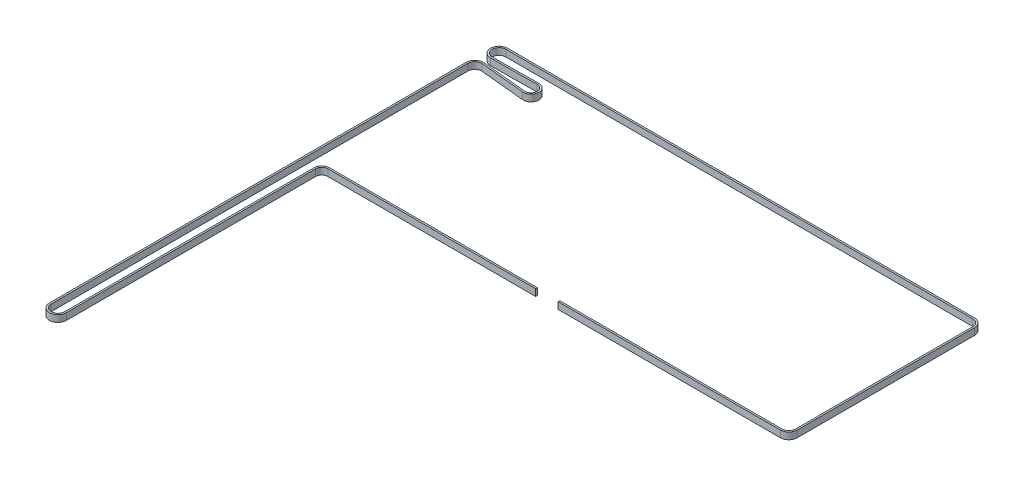
ISO-10303-21;
HEADER;
FILE_DESCRIPTION(('STEP AP214'),'2;1');
FILE_NAME('part.step','',(''),(''),'','','');
FILE_SCHEMA(('AUTOMOTIVE_DESIGN { 1 0 10303 214 1 1 1 1 }'));
ENDSEC;
DATA;
#1=APPLICATION_CONTEXT('core data for automotive mechanical design processes');
#2=APPLICATION_PROTOCOL_DEFINITION('international standard','automotive_design',2000,#1);
#3=PRODUCT_CONTEXT('',#1,'mechanical');
#4=PRODUCT('Part','Part','',(#3));
#5=PRODUCT_RELATED_PRODUCT_CATEGORY('part','',(#4));
#6=PRODUCT_DEFINITION_FORMATION('','',#4);
#7=PRODUCT_DEFINITION_CONTEXT('part definition',#1,'design');
#8=PRODUCT_DEFINITION('design','',#6,#7);
#9=PRODUCT_DEFINITION_SHAPE('','',#8);
#10=(LENGTH_UNIT() NAMED_UNIT(*) SI_UNIT(.MILLI.,.METRE.));
#11=(NAMED_UNIT(*) PLANE_ANGLE_UNIT() SI_UNIT($,.RADIAN.));
#12=(NAMED_UNIT(*) SI_UNIT($,.STERADIAN.) SOLID_ANGLE_UNIT());
#13=UNCERTAINTY_MEASURE_WITH_UNIT(LENGTH_MEASURE(1.E-05),#10,'distance_accuracy_value','');
#14=(GEOMETRIC_REPRESENTATION_CONTEXT(3) GLOBAL_UNCERTAINTY_ASSIGNED_CONTEXT((#13)) GLOBAL_UNIT_ASSIGNED_CONTEXT((#10,
#11,#12)) REPRESENTATION_CONTEXT('',''));
#15=CARTESIAN_POINT('',(0.,0.,0.));
#16=DIRECTION('',(0.,0.,1.));
#17=DIRECTION('',(1.,0.,0.));
#18=AXIS2_PLACEMENT_3D('',#15,#16,#17);
#19=CARTESIAN_POINT('',(207.5,190.5,-34.95));
#20=DIRECTION('',(0.,0.,1.));
#21=DIRECTION('',(1.,0.,0.));
#22=AXIS2_PLACEMENT_3D('',#19,#20,#21);
#23=PLANE('',#22);
#24=DIRECTION('',(-1.,0.,0.));
#25=VECTOR('',#24,1.);
#26=CARTESIAN_POINT('',(207.5,184.5,-34.95));
#27=LINE('',#26,#25);
#28=CARTESIAN_POINT('',(207.5,184.5,-34.95));
#29=VERTEX_POINT('',#28);
#30=CARTESIAN_POINT('',(10.,184.5,-34.95));
#31=VERTEX_POINT('',#30);
#32=EDGE_CURVE('E256',#29,#31,#27,.T.);
#33=ORIENTED_EDGE('',*,*,#32,.T.);
#34=DIRECTION('',(0.,-1.,0.));
#35=VECTOR('',#34,1.);
#36=CARTESIAN_POINT('',(10.,190.5,-34.95));
#37=LINE('',#36,#35);
#38=CARTESIAN_POINT('',(10.,190.5,-34.95));
#39=VERTEX_POINT('',#38);
#40=EDGE_CURVE('E11',#39,#31,#37,.T.);
#41=ORIENTED_EDGE('',*,*,#40,.F.);
#42=DIRECTION('',(-1.,0.,0.));
#43=VECTOR('',#42,1.);
#44=CARTESIAN_POINT('',(207.5,190.5,-34.95));
#45=LINE('',#44,#43);
#46=CARTESIAN_POINT('',(207.5,190.5,-34.95));
#47=VERTEX_POINT('',#46);
#48=EDGE_CURVE('E145',#47,#39,#45,.T.);
#49=ORIENTED_EDGE('',*,*,#48,.F.);
#50=DIRECTION('',(0.,-1.,0.));
#51=VECTOR('',#50,1.);
#52=CARTESIAN_POINT('',(207.5,190.5,-34.95));
#53=LINE('',#52,#51);
#54=EDGE_CURVE('E252',#47,#29,#53,.T.);
#55=ORIENTED_EDGE('',*,*,#54,.T.);
#56=EDGE_LOOP('',(#33,#41,#49,#55));
#57=FACE_BOUND('',#56,.T.);
#58=ADVANCED_FACE('F17',(#57),#23,.F.);
#59=CARTESIAN_POINT('',(10.,190.5,-33.45));
#60=DIRECTION('',(-1.,0.,0.));
#61=DIRECTION('',(0.,0.,1.));
#62=AXIS2_PLACEMENT_3D('',#59,#60,#61);
#63=PLANE('',#62);
#64=DIRECTION('',(0.,0.,-1.));
#65=VECTOR('',#64,1.);
#66=CARTESIAN_POINT('',(10.,184.5,-33.45));
#67=LINE('',#66,#65);
#68=CARTESIAN_POINT('',(10.,184.5,-33.45));
#69=VERTEX_POINT('',#68);
#70=EDGE_CURVE('E259',#69,#31,#67,.T.);
#71=ORIENTED_EDGE('',*,*,#70,.F.);
#72=DIRECTION('',(0.,-1.,0.));
#73=VECTOR('',#72,1.);
#74=CARTESIAN_POINT('',(10.,190.5,-33.45));
#75=LINE('',#74,#73);
#76=CARTESIAN_POINT('',(10.,190.5,-33.45));
#77=VERTEX_POINT('',#76);
#78=EDGE_CURVE('E25',#77,#69,#75,.T.);
#79=ORIENTED_EDGE('',*,*,#78,.F.);
#80=DIRECTION('',(0.,0.,-1.));
#81=VECTOR('',#80,1.);
#82=CARTESIAN_POINT('',(10.,190.5,-33.45));
#83=LINE('',#82,#81);
#84=EDGE_CURVE('E421',#77,#39,#83,.T.);
#85=ORIENTED_EDGE('',*,*,#84,.T.);
#86=ORIENTED_EDGE('',*,*,#40,.T.);
#87=EDGE_LOOP('',(#71,#79,#85,#86));
#88=FACE_BOUND('',#87,.T.);
#89=ADVANCED_FACE('F408',(#88),#63,.T.);
#90=CARTESIAN_POINT('',(207.5,190.5,-33.45));
#91=DIRECTION('',(0.,0.,1.));
#92=DIRECTION('',(1.,0.,0.));
#93=AXIS2_PLACEMENT_3D('',#90,#91,#92);
#94=PLANE('',#93);
#95=DIRECTION('',(-1.,0.,0.));
#96=VECTOR('',#95,1.);
#97=CARTESIAN_POINT('',(207.5,184.5,-33.45));
#98=LINE('',#97,#96);
#99=CARTESIAN_POINT('',(207.5,184.5,-33.45));
#100=VERTEX_POINT('',#99);
#101=EDGE_CURVE('E262',#100,#69,#98,.T.);
#102=ORIENTED_EDGE('',*,*,#101,.F.);
#103=DIRECTION('',(0.,-1.,0.));
#104=VECTOR('',#103,1.);
#105=CARTESIAN_POINT('',(207.5,190.5,-33.45));
#106=LINE('',#105,#104);
#107=CARTESIAN_POINT('',(207.5,190.5,-33.45));
#108=VERTEX_POINT('',#107);
#109=EDGE_CURVE('E398',#108,#100,#106,.T.);
#110=ORIENTED_EDGE('',*,*,#109,.F.);
#111=DIRECTION('',(-1.,0.,0.));
#112=VECTOR('',#111,1.);
#113=CARTESIAN_POINT('',(207.5,190.5,-33.45));
#114=LINE('',#113,#112);
#115=EDGE_CURVE('E405',#108,#77,#114,.T.);
#116=ORIENTED_EDGE('',*,*,#115,.T.);
#117=ORIENTED_EDGE('',*,*,#78,.T.);
#118=EDGE_LOOP('',(#102,#110,#116,#117));
#119=FACE_BOUND('',#118,.T.);
#120=ADVANCED_FACE('F403',(#119),#94,.T.);
#121=CARTESIAN_POINT('',(207.5,190.5,-40.95));
#122=DIRECTION('',(0.,-1.,0.));
#123=DIRECTION('',(0.,0.,-1.));
#124=AXIS2_PLACEMENT_3D('',#121,#122,#123);
#125=CYLINDRICAL_SURFACE('',#124,7.5);
#126=CARTESIAN_POINT('',(207.5,184.5,-40.95));
#127=DIRECTION('',(0.,1.,0.));
#128=DIRECTION('',(1.,0.,0.));
#129=AXIS2_PLACEMENT_3D('',#126,#127,#128);
#130=CIRCLE('',#129,7.5);
#131=CARTESIAN_POINT('',(215.,184.5,-40.95));
#132=VERTEX_POINT('',#131);
#133=EDGE_CURVE('E265',#132,#100,#130,.F.);
#134=ORIENTED_EDGE('',*,*,#133,.F.);
#135=DIRECTION('',(0.,-1.,0.));
#136=VECTOR('',#135,1.);
#137=CARTESIAN_POINT('',(215.,190.5,-40.95));
#138=LINE('',#137,#136);
#139=CARTESIAN_POINT('',(215.,190.5,-40.95));
#140=VERTEX_POINT('',#139);
#141=EDGE_CURVE('E396',#140,#132,#138,.T.);
#142=ORIENTED_EDGE('',*,*,#141,.F.);
#143=CARTESIAN_POINT('',(207.5,190.5,-40.95));
#144=DIRECTION('',(0.,1.,0.));
#145=DIRECTION('',(1.,0.,0.));
#146=AXIS2_PLACEMENT_3D('',#143,#144,#145);
#147=CIRCLE('',#146,7.5);
#148=EDGE_CURVE('E418',#140,#108,#147,.F.);
#149=ORIENTED_EDGE('',*,*,#148,.T.);
#150=ORIENTED_EDGE('',*,*,#109,.T.);
#151=EDGE_LOOP('',(#134,#142,#149,#150));
#152=FACE_BOUND('',#151,.T.);
#153=ADVANCED_FACE('F415',(#152),#125,.T.);
#154=CARTESIAN_POINT('',(215.,190.5,-198.5));
#155=DIRECTION('',(1.,0.,0.));
#156=DIRECTION('',(0.,0.,-1.));
#157=AXIS2_PLACEMENT_3D('',#154,#155,#156);
#158=PLANE('',#157);
#159=DIRECTION('',(0.,0.,-1.));
#160=VECTOR('',#159,1.);
#161=CARTESIAN_POINT('',(215.,184.5,-198.5));
#162=LINE('',#161,#160);
#163=CARTESIAN_POINT('',(215.,184.5,-198.5));
#164=VERTEX_POINT('',#163);
#165=EDGE_CURVE('E268',#164,#132,#162,.F.);
#166=ORIENTED_EDGE('',*,*,#165,.F.);
#167=DIRECTION('',(0.,-1.,0.));
#168=VECTOR('',#167,1.);
#169=CARTESIAN_POINT('',(215.,190.5,-198.5));
#170=LINE('',#169,#168);
#171=CARTESIAN_POINT('',(215.,190.5,-198.5));
#172=VERTEX_POINT('',#171);
#173=EDGE_CURVE('E394',#172,#164,#170,.T.);
#174=ORIENTED_EDGE('',*,*,#173,.F.);
#175=DIRECTION('',(0.,0.,-1.));
#176=VECTOR('',#175,1.);
#177=CARTESIAN_POINT('',(215.,190.5,-198.5));
#178=LINE('',#177,#176);
#179=EDGE_CURVE('E423',#172,#140,#178,.F.);
#180=ORIENTED_EDGE('',*,*,#179,.T.);
#181=ORIENTED_EDGE('',*,*,#141,.T.);
#182=EDGE_LOOP('',(#166,#174,#180,#181));
#183=FACE_BOUND('',#182,.T.);
#184=ADVANCED_FACE('F523',(#183),#158,.T.);
#185=CARTESIAN_POINT('',(207.5,190.5,-198.5));
#186=DIRECTION('',(0.,-1.,0.));
#187=DIRECTION('',(0.,0.,-1.));
#188=AXIS2_PLACEMENT_3D('',#185,#186,#187);
#189=CYLINDRICAL_SURFACE('',#188,7.5);
#190=CARTESIAN_POINT('',(207.5,184.5,-198.5));
#191=DIRECTION('',(0.,1.,0.));
#192=DIRECTION('',(1.,0.,0.));
#193=AXIS2_PLACEMENT_3D('',#190,#191,#192);
#194=CIRCLE('',#193,7.5);
#195=CARTESIAN_POINT('',(207.5,184.5,-206.));
#196=VERTEX_POINT('',#195);
#197=EDGE_CURVE('E271',#196,#164,#194,.F.);
#198=ORIENTED_EDGE('',*,*,#197,.F.);
#199=DIRECTION('',(0.,-1.,0.));
#200=VECTOR('',#199,1.);
#201=CARTESIAN_POINT('',(207.5,190.5,-206.));
#202=LINE('',#201,#200);
#203=CARTESIAN_POINT('',(207.5,190.5,-206.));
#204=VERTEX_POINT('',#203);
#205=EDGE_CURVE('E392',#204,#196,#202,.T.);
#206=ORIENTED_EDGE('',*,*,#205,.F.);
#207=CARTESIAN_POINT('',(207.5,190.5,-198.5));
#208=DIRECTION('',(0.,1.,0.));
#209=DIRECTION('',(1.,0.,0.));
#210=AXIS2_PLACEMENT_3D('',#207,#208,#209);
#211=CIRCLE('',#210,7.5);
#212=EDGE_CURVE('E429',#204,#172,#211,.F.);
#213=ORIENTED_EDGE('',*,*,#212,.T.);
#214=ORIENTED_EDGE('',*,*,#173,.T.);
#215=EDGE_LOOP('',(#198,#206,#213,#214));
#216=FACE_BOUND('',#215,.T.);
#217=ADVANCED_FACE('F526',(#216),#189,.T.);
#218=CARTESIAN_POINT('',(-207.5,190.5,-206.));
#219=DIRECTION('',(0.,0.,-1.));
#220=DIRECTION('',(-1.,0.,0.));
#221=AXIS2_PLACEMENT_3D('',#218,#219,#220);
#222=PLANE('',#221);
#223=DIRECTION('',(1.,0.,0.));
#224=VECTOR('',#223,1.);
#225=CARTESIAN_POINT('',(-207.5,184.5,-206.));
#226=LINE('',#225,#224);
#227=CARTESIAN_POINT('',(-207.5,184.5,-206.));
#228=VERTEX_POINT('',#227);
#229=EDGE_CURVE('E274',#228,#196,#226,.T.);
#230=ORIENTED_EDGE('',*,*,#229,.F.);
#231=DIRECTION('',(0.,-1.,0.));
#232=VECTOR('',#231,1.);
#233=CARTESIAN_POINT('',(-207.5,190.5,-206.));
#234=LINE('',#233,#232);
#235=CARTESIAN_POINT('',(-207.5,190.5,-206.));
#236=VERTEX_POINT('',#235);
#237=EDGE_CURVE('E390',#236,#228,#234,.T.);
#238=ORIENTED_EDGE('',*,*,#237,.F.);
#239=DIRECTION('',(1.,0.,0.));
#240=VECTOR('',#239,1.);
#241=CARTESIAN_POINT('',(-207.5,190.5,-206.));
#242=LINE('',#241,#240);
#243=EDGE_CURVE('E432',#236,#204,#242,.T.);
#244=ORIENTED_EDGE('',*,*,#243,.T.);
#245=ORIENTED_EDGE('',*,*,#205,.T.);
#246=EDGE_LOOP('',(#230,#238,#244,#245));
#247=FACE_BOUND('',#246,.T.);
#248=ADVANCED_FACE('F530',(#247),#222,.T.);
#249=CARTESIAN_POINT('',(-207.5,190.5,-198.5));
#250=DIRECTION('',(0.,-1.,0.));
#251=DIRECTION('',(0.,0.,-1.));
#252=AXIS2_PLACEMENT_3D('',#249,#250,#251);
#253=CYLINDRICAL_SURFACE('',#252,7.5);
#254=CARTESIAN_POINT('',(-207.5,184.5,-198.5));
#255=DIRECTION('',(0.,1.,0.));
#256=DIRECTION('',(1.,0.,0.));
#257=AXIS2_PLACEMENT_3D('',#254,#255,#256);
#258=CIRCLE('',#257,7.5);
#259=CARTESIAN_POINT('',(-207.426720120552,184.5,-191.000358004593));
#260=VERTEX_POINT('',#259);
#261=EDGE_CURVE('E277',#260,#228,#258,.F.);
#262=ORIENTED_EDGE('',*,*,#261,.F.);
#263=DIRECTION('',(0.,-1.,0.));
#264=VECTOR('',#263,1.);
#265=CARTESIAN_POINT('',(-207.426720120552,190.5,-191.000358004593));
#266=LINE('',#265,#264);
#267=CARTESIAN_POINT('',(-207.426720120552,190.5,-191.000358004593));
#268=VERTEX_POINT('',#267);
#269=EDGE_CURVE('E388',#268,#260,#266,.T.);
#270=ORIENTED_EDGE('',*,*,#269,.F.);
#271=CARTESIAN_POINT('',(-207.5,190.5,-198.5));
#272=DIRECTION('',(0.,1.,0.));
#273=DIRECTION('',(1.,0.,0.));
#274=AXIS2_PLACEMENT_3D('',#271,#272,#273);
#275=CIRCLE('',#274,7.5);
#276=EDGE_CURVE('E435',#268,#236,#275,.F.);
#277=ORIENTED_EDGE('',*,*,#276,.T.);
#278=ORIENTED_EDGE('',*,*,#237,.T.);
#279=EDGE_LOOP('',(#262,#270,#277,#278));
#280=FACE_BOUND('',#279,.T.);
#281=ADVANCED_FACE('F534',(#280),#253,.T.);
#282=CARTESIAN_POINT('',(-166.552761513203,190.5,-191.399742236688));
#283=DIRECTION('',(0.0097706505931108,0.,0.999952266054229));
#284=DIRECTION('',(0.999952266054229,0.,-0.0097706505931108));
#285=AXIS2_PLACEMENT_3D('',#282,#283,#284);
#286=PLANE('',#285);
#287=DIRECTION('',(-0.999952266054229,0.,0.0097706505931108));
#288=VECTOR('',#287,1.);
#289=CARTESIAN_POINT('',(-166.552761513203,184.5,-191.399742236688));
#290=LINE('',#289,#288);
#291=CARTESIAN_POINT('',(-166.552761513203,184.5,-191.399742236688));
#292=VERTEX_POINT('',#291);
#293=EDGE_CURVE('E280',#292,#260,#290,.T.);
#294=ORIENTED_EDGE('',*,*,#293,.F.);
#295=DIRECTION('',(0.,-1.,0.));
#296=VECTOR('',#295,1.);
#297=CARTESIAN_POINT('',(-166.552761513203,190.5,-191.399742236688));
#298=LINE('',#297,#296);
#299=CARTESIAN_POINT('',(-166.552761513203,190.5,-191.399742236688));
#300=VERTEX_POINT('',#299);
#301=EDGE_CURVE('E386',#300,#292,#298,.T.);
#302=ORIENTED_EDGE('',*,*,#301,.F.);
#303=DIRECTION('',(-0.999952266054229,0.,0.0097706505931108));
#304=VECTOR('',#303,1.);
#305=CARTESIAN_POINT('',(-166.552761513203,190.5,-191.399742236688));
#306=LINE('',#305,#304);
#307=EDGE_CURVE('E438',#300,#268,#306,.T.);
#308=ORIENTED_EDGE('',*,*,#307,.T.);
#309=ORIENTED_EDGE('',*,*,#269,.T.);
#310=EDGE_LOOP('',(#294,#302,#308,#309));
#311=FACE_BOUND('',#310,.T.);
#312=ADVANCED_FACE('F538',(#311),#286,.T.);
#313=CARTESIAN_POINT('',(-166.5,190.5,-185.999999999996));
#314=DIRECTION('',(0.,-1.,0.));
#315=DIRECTION('',(0.,0.,-1.));
#316=AXIS2_PLACEMENT_3D('',#313,#314,#315);
#317=CYLINDRICAL_SURFACE('',#316,5.4);
#318=CARTESIAN_POINT('',(-166.5,184.5,-185.999999999996));
#319=DIRECTION('',(0.,1.,0.));
#320=DIRECTION('',(1.,0.,0.));
#321=AXIS2_PLACEMENT_3D('',#318,#319,#320);
#322=CIRCLE('',#321,5.4);
#323=CARTESIAN_POINT('',(-167.005756118477,184.5,-180.623736357965));
#324=VERTEX_POINT('',#323);
#325=EDGE_CURVE('E283',#324,#292,#322,.T.);
#326=ORIENTED_EDGE('',*,*,#325,.F.);
#327=DIRECTION('',(0.,-1.,0.));
#328=VECTOR('',#327,1.);
#329=CARTESIAN_POINT('',(-167.005756118477,190.5,-180.623736357965));
#330=LINE('',#329,#328);
#331=CARTESIAN_POINT('',(-167.005756118477,190.5,-180.623736357965));
#332=VERTEX_POINT('',#331);
#333=EDGE_CURVE('E384',#332,#324,#330,.T.);
#334=ORIENTED_EDGE('',*,*,#333,.F.);
#335=CARTESIAN_POINT('',(-166.5,190.5,-185.999999999996));
#336=DIRECTION('',(0.,1.,0.));
#337=DIRECTION('',(1.,0.,0.));
#338=AXIS2_PLACEMENT_3D('',#335,#336,#337);
#339=CIRCLE('',#338,5.4);
#340=EDGE_CURVE('E441',#332,#300,#339,.T.);
#341=ORIENTED_EDGE('',*,*,#340,.T.);
#342=ORIENTED_EDGE('',*,*,#301,.T.);
#343=EDGE_LOOP('',(#326,#334,#341,#342));
#344=FACE_BOUND('',#343,.T.);
#345=ADVANCED_FACE('F542',(#344),#317,.F.);
#346=CARTESIAN_POINT('',(-206.797560946561,190.5,-184.367032836154));
#347=DIRECTION('',(0.0936585404586421,0.,-0.995604378153871));
#348=DIRECTION('',(-0.995604378153871,0.,-0.0936585404586421));
#349=AXIS2_PLACEMENT_3D('',#346,#347,#348);
#350=PLANE('',#349);
#351=DIRECTION('',(0.995604378153871,0.,0.0936585404586421));
#352=VECTOR('',#351,1.);
#353=CARTESIAN_POINT('',(-206.797560946561,184.5,-184.367032836154));
#354=LINE('',#353,#352);
#355=CARTESIAN_POINT('',(-206.797560946561,184.5,-184.367032836154));
#356=VERTEX_POINT('',#355);
#357=EDGE_CURVE('E286',#356,#324,#354,.T.);
#358=ORIENTED_EDGE('',*,*,#357,.F.);
#359=DIRECTION('',(0.,-1.,0.));
#360=VECTOR('',#359,1.);
#361=CARTESIAN_POINT('',(-206.797560946561,190.5,-184.367032836154));
#362=LINE('',#361,#360);
#363=CARTESIAN_POINT('',(-206.797560946561,190.5,-184.367032836154));
#364=VERTEX_POINT('',#363);
#365=EDGE_CURVE('E382',#364,#356,#362,.T.);
#366=ORIENTED_EDGE('',*,*,#365,.F.);
#367=DIRECTION('',(0.995604378153871,0.,0.0936585404586421));
#368=VECTOR('',#367,1.);
#369=CARTESIAN_POINT('',(-206.797560946561,190.5,-184.367032836154));
#370=LINE('',#369,#368);
#371=EDGE_CURVE('E444',#364,#332,#370,.T.);
#372=ORIENTED_EDGE('',*,*,#371,.T.);
#373=ORIENTED_EDGE('',*,*,#333,.T.);
#374=EDGE_LOOP('',(#358,#366,#372,#373));
#375=FACE_BOUND('',#374,.T.);
#376=ADVANCED_FACE('F546',(#375),#350,.T.);
#377=CARTESIAN_POINT('',(-207.5,190.5,-176.9));
#378=DIRECTION('',(0.,-1.,0.));
#379=DIRECTION('',(0.,0.,-1.));
#380=AXIS2_PLACEMENT_3D('',#377,#378,#379);
#381=CYLINDRICAL_SURFACE('',#380,7.5);
#382=CARTESIAN_POINT('',(-207.5,184.5,-176.9));
#383=DIRECTION('',(0.,1.,0.));
#384=DIRECTION('',(1.,0.,0.));
#385=AXIS2_PLACEMENT_3D('',#382,#383,#384);
#386=CIRCLE('',#385,7.5);
#387=CARTESIAN_POINT('',(-215.,184.5,-176.9));
#388=VERTEX_POINT('',#387);
#389=EDGE_CURVE('E289',#388,#356,#386,.F.);
#390=ORIENTED_EDGE('',*,*,#389,.F.);
#391=DIRECTION('',(0.,-1.,0.));
#392=VECTOR('',#391,1.);
#393=CARTESIAN_POINT('',(-215.,190.5,-176.9));
#394=LINE('',#393,#392);
#395=CARTESIAN_POINT('',(-215.,190.5,-176.9));
#396=VERTEX_POINT('',#395);
#397=EDGE_CURVE('E380',#396,#388,#394,.T.);
#398=ORIENTED_EDGE('',*,*,#397,.F.);
#399=CARTESIAN_POINT('',(-207.5,190.5,-176.9));
#400=DIRECTION('',(0.,1.,0.));
#401=DIRECTION('',(1.,0.,0.));
#402=AXIS2_PLACEMENT_3D('',#399,#400,#401);
#403=CIRCLE('',#402,7.5);
#404=EDGE_CURVE('E447',#396,#364,#403,.F.);
#405=ORIENTED_EDGE('',*,*,#404,.T.);
#406=ORIENTED_EDGE('',*,*,#365,.T.);
#407=EDGE_LOOP('',(#390,#398,#405,#406));
#408=FACE_BOUND('',#407,.T.);
#409=ADVANCED_FACE('F550',(#408),#381,.T.);
#410=CARTESIAN_POINT('',(-215.,190.5,-176.9));
#411=DIRECTION('',(-1.,0.,0.));
#412=DIRECTION('',(0.,0.,1.));
#413=AXIS2_PLACEMENT_3D('',#410,#411,#412);
#414=PLANE('',#413);
#415=DIRECTION('',(0.,0.,-1.));
#416=VECTOR('',#415,1.);
#417=CARTESIAN_POINT('',(-215.,184.5,-176.9));
#418=LINE('',#417,#416);
#419=CARTESIAN_POINT('',(-215.,184.5,193.5));
#420=VERTEX_POINT('',#419);
#421=EDGE_CURVE('E292',#420,#388,#418,.T.);
#422=ORIENTED_EDGE('',*,*,#421,.F.);
#423=DIRECTION('',(0.,-1.,0.));
#424=VECTOR('',#423,1.);
#425=CARTESIAN_POINT('',(-215.,190.5,193.5));
#426=LINE('',#425,#424);
#427=CARTESIAN_POINT('',(-215.,190.5,193.5));
#428=VERTEX_POINT('',#427);
#429=EDGE_CURVE('E378',#428,#420,#426,.T.);
#430=ORIENTED_EDGE('',*,*,#429,.F.);
#431=DIRECTION('',(0.,0.,-1.));
#432=VECTOR('',#431,1.);
#433=CARTESIAN_POINT('',(-215.,190.5,-176.9));
#434=LINE('',#433,#432);
#435=EDGE_CURVE('E450',#428,#396,#434,.T.);
#436=ORIENTED_EDGE('',*,*,#435,.T.);
#437=ORIENTED_EDGE('',*,*,#397,.T.);
#438=EDGE_LOOP('',(#422,#430,#436,#437));
#439=FACE_BOUND('',#438,.T.);
#440=ADVANCED_FACE('F554',(#439),#414,.T.);
#441=CARTESIAN_POINT('',(-207.5,190.5,193.5));
#442=DIRECTION('',(0.,-1.,0.));
#443=DIRECTION('',(0.,0.,-1.));
#444=AXIS2_PLACEMENT_3D('',#441,#442,#443);
#445=CYLINDRICAL_SURFACE('',#444,7.5);
#446=CARTESIAN_POINT('',(-207.5,184.5,193.5));
#447=DIRECTION('',(0.,1.,0.));
#448=DIRECTION('',(1.,0.,0.));
#449=AXIS2_PLACEMENT_3D('',#446,#447,#448);
#450=CIRCLE('',#449,7.5);
#451=CARTESIAN_POINT('',(-200.,184.5,193.5));
#452=VERTEX_POINT('',#451);
#453=EDGE_CURVE('E295',#452,#420,#450,.F.);
#454=ORIENTED_EDGE('',*,*,#453,.F.);
#455=DIRECTION('',(0.,-1.,0.));
#456=VECTOR('',#455,1.);
#457=CARTESIAN_POINT('',(-200.,190.5,193.5));
#458=LINE('',#457,#456);
#459=CARTESIAN_POINT('',(-200.,190.5,193.5));
#460=VERTEX_POINT('',#459);
#461=EDGE_CURVE('E376',#460,#452,#458,.T.);
#462=ORIENTED_EDGE('',*,*,#461,.F.);
#463=CARTESIAN_POINT('',(-207.5,190.5,193.5));
#464=DIRECTION('',(0.,1.,0.));
#465=DIRECTION('',(1.,0.,0.));
#466=AXIS2_PLACEMENT_3D('',#463,#464,#465);
#467=CIRCLE('',#466,7.5);
#468=EDGE_CURVE('E453',#460,#428,#467,.F.);
#469=ORIENTED_EDGE('',*,*,#468,.T.);
#470=ORIENTED_EDGE('',*,*,#429,.T.);
#471=EDGE_LOOP('',(#454,#462,#469,#470));
#472=FACE_BOUND('',#471,.T.);
#473=ADVANCED_FACE('F558',(#472),#445,.T.);
#474=CARTESIAN_POINT('',(-200.,190.5,193.5));
#475=DIRECTION('',(1.,0.,0.));
#476=DIRECTION('',(0.,0.,-1.));
#477=AXIS2_PLACEMENT_3D('',#474,#475,#476);
#478=PLANE('',#477);
#479=DIRECTION('',(0.,0.,1.));
#480=VECTOR('',#479,1.);
#481=CARTESIAN_POINT('',(-200.,184.5,193.5));
#482=LINE('',#481,#480);
#483=CARTESIAN_POINT('',(-200.,184.5,-28.05));
#484=VERTEX_POINT('',#483);
#485=EDGE_CURVE('E298',#484,#452,#482,.T.);
#486=ORIENTED_EDGE('',*,*,#485,.F.);
#487=DIRECTION('',(0.,-1.,0.));
#488=VECTOR('',#487,1.);
#489=CARTESIAN_POINT('',(-200.,190.5,-28.05));
#490=LINE('',#489,#488);
#491=CARTESIAN_POINT('',(-200.,190.5,-28.05));
#492=VERTEX_POINT('',#491);
#493=EDGE_CURVE('E374',#492,#484,#490,.T.);
#494=ORIENTED_EDGE('',*,*,#493,.F.);
#495=DIRECTION('',(0.,0.,1.));
#496=VECTOR('',#495,1.);
#497=CARTESIAN_POINT('',(-200.,190.5,193.5));
#498=LINE('',#497,#496);
#499=EDGE_CURVE('E456',#492,#460,#498,.T.);
#500=ORIENTED_EDGE('',*,*,#499,.T.);
#501=ORIENTED_EDGE('',*,*,#461,.T.);
#502=EDGE_LOOP('',(#486,#494,#500,#501));
#503=FACE_BOUND('',#502,.T.);
#504=ADVANCED_FACE('F562',(#503),#478,.T.);
#505=CARTESIAN_POINT('',(-194.6,190.5,-28.05));
#506=DIRECTION('',(0.,-1.,0.));
#507=DIRECTION('',(0.,0.,-1.));
#508=AXIS2_PLACEMENT_3D('',#505,#506,#507);
#509=CYLINDRICAL_SURFACE('',#508,5.40000000000006);
#510=CARTESIAN_POINT('',(-194.6,184.5,-28.05));
#511=DIRECTION('',(0.,1.,0.));
#512=DIRECTION('',(1.,0.,0.));
#513=AXIS2_PLACEMENT_3D('',#510,#511,#512);
#514=CIRCLE('',#513,5.40000000000006);
#515=CARTESIAN_POINT('',(-194.6,184.5,-33.45));
#516=VERTEX_POINT('',#515);
#517=EDGE_CURVE('E301',#516,#484,#514,.T.);
#518=ORIENTED_EDGE('',*,*,#517,.F.);
#519=DIRECTION('',(0.,-1.,0.));
#520=VECTOR('',#519,1.);
#521=CARTESIAN_POINT('',(-194.6,190.5,-33.45));
#522=LINE('',#521,#520);
#523=CARTESIAN_POINT('',(-194.6,190.5,-33.45));
#524=VERTEX_POINT('',#523);
#525=EDGE_CURVE('E372',#524,#516,#522,.T.);
#526=ORIENTED_EDGE('',*,*,#525,.F.);
#527=CARTESIAN_POINT('',(-194.6,190.5,-28.05));
#528=DIRECTION('',(0.,1.,0.));
#529=DIRECTION('',(1.,0.,0.));
#530=AXIS2_PLACEMENT_3D('',#527,#528,#529);
#531=CIRCLE('',#530,5.40000000000006);
#532=EDGE_CURVE('E459',#524,#492,#531,.T.);
#533=ORIENTED_EDGE('',*,*,#532,.T.);
#534=ORIENTED_EDGE('',*,*,#493,.T.);
#535=EDGE_LOOP('',(#518,#526,#533,#534));
#536=FACE_BOUND('',#535,.T.);
#537=ADVANCED_FACE('F566',(#536),#509,.F.);
#538=CARTESIAN_POINT('',(-194.6,190.5,-33.45));
#539=DIRECTION('',(0.,0.,1.));
#540=DIRECTION('',(1.,0.,0.));
#541=AXIS2_PLACEMENT_3D('',#538,#539,#540);
#542=PLANE('',#541);
#543=DIRECTION('',(1.,0.,0.));
#544=VECTOR('',#543,1.);
#545=CARTESIAN_POINT('',(-194.6,184.5,-33.45));
#546=LINE('',#545,#544);
#547=CARTESIAN_POINT('',(-10.,184.5,-33.45));
#548=VERTEX_POINT('',#547);
#549=EDGE_CURVE('E304',#548,#516,#546,.F.);
#550=ORIENTED_EDGE('',*,*,#549,.F.);
#551=DIRECTION('',(0.,-1.,0.));
#552=VECTOR('',#551,1.);
#553=CARTESIAN_POINT('',(-10.,190.5,-33.45));
#554=LINE('',#553,#552);
#555=CARTESIAN_POINT('',(-10.,190.5,-33.45));
#556=VERTEX_POINT('',#555);
#557=EDGE_CURVE('E370',#556,#548,#554,.T.);
#558=ORIENTED_EDGE('',*,*,#557,.F.);
#559=DIRECTION('',(1.,0.,0.));
#560=VECTOR('',#559,1.);
#561=CARTESIAN_POINT('',(-194.6,190.5,-33.45));
#562=LINE('',#561,#560);
#563=EDGE_CURVE('E462',#556,#524,#562,.F.);
#564=ORIENTED_EDGE('',*,*,#563,.T.);
#565=ORIENTED_EDGE('',*,*,#525,.T.);
#566=EDGE_LOOP('',(#550,#558,#564,#565));
#567=FACE_BOUND('',#566,.T.);
#568=ADVANCED_FACE('F570',(#567),#542,.T.);
#569=CARTESIAN_POINT('',(-10.,190.5,-34.95));
#570=DIRECTION('',(1.,0.,0.));
#571=DIRECTION('',(0.,0.,-1.));
#572=AXIS2_PLACEMENT_3D('',#569,#570,#571);
#573=PLANE('',#572);
#574=DIRECTION('',(0.,0.,1.));
#575=VECTOR('',#574,1.);
#576=CARTESIAN_POINT('',(-10.,184.5,-34.95));
#577=LINE('',#576,#575);
#578=CARTESIAN_POINT('',(-10.,184.5,-34.95));
#579=VERTEX_POINT('',#578);
#580=EDGE_CURVE('E307',#579,#548,#577,.T.);
#581=ORIENTED_EDGE('',*,*,#580,.F.);
#582=DIRECTION('',(0.,-1.,0.));
#583=VECTOR('',#582,1.);
#584=CARTESIAN_POINT('',(-10.,190.5,-34.95));
#585=LINE('',#584,#583);
#586=CARTESIAN_POINT('',(-10.,190.5,-34.95));
#587=VERTEX_POINT('',#586);
#588=EDGE_CURVE('E368',#587,#579,#585,.T.);
#589=ORIENTED_EDGE('',*,*,#588,.F.);
#590=DIRECTION('',(0.,0.,1.));
#591=VECTOR('',#590,1.);
#592=CARTESIAN_POINT('',(-10.,190.5,-34.95));
#593=LINE('',#592,#591);
#594=EDGE_CURVE('E465',#587,#556,#593,.T.);
#595=ORIENTED_EDGE('',*,*,#594,.T.);
#596=ORIENTED_EDGE('',*,*,#557,.T.);
#597=EDGE_LOOP('',(#581,#589,#595,#596));
#598=FACE_BOUND('',#597,.T.);
#599=ADVANCED_FACE('F574',(#598),#573,.T.);
#600=CARTESIAN_POINT('',(-194.6,190.5,-34.95));
#601=DIRECTION('',(0.,0.,1.));
#602=DIRECTION('',(1.,0.,0.));
#603=AXIS2_PLACEMENT_3D('',#600,#601,#602);
#604=PLANE('',#603);
#605=DIRECTION('',(-1.,0.,0.));
#606=VECTOR('',#605,1.);
#607=CARTESIAN_POINT('',(-194.6,184.5,-34.95));
#608=LINE('',#607,#606);
#609=CARTESIAN_POINT('',(-194.6,184.5,-34.95));
#610=VERTEX_POINT('',#609);
#611=EDGE_CURVE('E310',#579,#610,#608,.T.);
#612=ORIENTED_EDGE('',*,*,#611,.T.);
#613=DIRECTION('',(0.,-1.,0.));
#614=VECTOR('',#613,1.);
#615=CARTESIAN_POINT('',(-194.6,190.5,-34.95));
#616=LINE('',#615,#614);
#617=CARTESIAN_POINT('',(-194.6,190.5,-34.95));
#618=VERTEX_POINT('',#617);
#619=EDGE_CURVE('E365',#618,#610,#616,.T.);
#620=ORIENTED_EDGE('',*,*,#619,.F.);
#621=DIRECTION('',(-1.,0.,0.));
#622=VECTOR('',#621,1.);
#623=CARTESIAN_POINT('',(-194.6,190.5,-34.95));
#624=LINE('',#623,#622);
#625=EDGE_CURVE('E468',#587,#618,#624,.T.);
#626=ORIENTED_EDGE('',*,*,#625,.F.);
#627=ORIENTED_EDGE('',*,*,#588,.T.);
#628=EDGE_LOOP('',(#612,#620,#626,#627));
#629=FACE_BOUND('',#628,.T.);
#630=ADVANCED_FACE('F578',(#629),#604,.F.);
#631=CARTESIAN_POINT('',(-194.6,190.5,-28.05));
#632=DIRECTION('',(0.,-1.,0.));
#633=DIRECTION('',(0.,0.,-1.));
#634=AXIS2_PLACEMENT_3D('',#631,#632,#633);
#635=CYLINDRICAL_SURFACE('',#634,6.9);
#636=CARTESIAN_POINT('',(-194.6,184.5,-28.05));
#637=DIRECTION('',(0.,1.,0.));
#638=DIRECTION('',(0.,0.,1.));
#639=AXIS2_PLACEMENT_3D('',#636,#637,#638);
#640=CIRCLE('',#639,6.9);
#641=CARTESIAN_POINT('',(-201.5,184.5,-28.05));
#642=VERTEX_POINT('',#641);
#643=EDGE_CURVE('E312',#610,#642,#640,.T.);
#644=ORIENTED_EDGE('',*,*,#643,.T.);
#645=DIRECTION('',(0.,-1.,0.));
#646=VECTOR('',#645,1.);
#647=CARTESIAN_POINT('',(-201.5,190.5,-28.05));
#648=LINE('',#647,#646);
#649=CARTESIAN_POINT('',(-201.5,190.5,-28.05));
#650=VERTEX_POINT('',#649);
#651=EDGE_CURVE('E362',#650,#642,#648,.T.);
#652=ORIENTED_EDGE('',*,*,#651,.F.);
#653=CARTESIAN_POINT('',(-194.6,190.5,-28.05));
#654=DIRECTION('',(0.,1.,0.));
#655=DIRECTION('',(0.,0.,1.));
#656=AXIS2_PLACEMENT_3D('',#653,#654,#655);
#657=CIRCLE('',#656,6.9);
#658=EDGE_CURVE('E470',#618,#650,#657,.T.);
#659=ORIENTED_EDGE('',*,*,#658,.F.);
#660=ORIENTED_EDGE('',*,*,#619,.T.);
#661=EDGE_LOOP('',(#644,#652,#659,#660));
#662=FACE_BOUND('',#661,.T.);
#663=ADVANCED_FACE('F582',(#662),#635,.T.);
#664=CARTESIAN_POINT('',(-201.5,190.5,193.5));
#665=DIRECTION('',(1.,0.,0.));
#666=DIRECTION('',(0.,0.,-1.));
#667=AXIS2_PLACEMENT_3D('',#664,#665,#666);
#668=PLANE('',#667);
#669=DIRECTION('',(0.,0.,1.));
#670=VECTOR('',#669,1.);
#671=CARTESIAN_POINT('',(-201.5,184.5,193.5));
#672=LINE('',#671,#670);
#673=CARTESIAN_POINT('',(-201.5,184.5,193.5));
#674=VERTEX_POINT('',#673);
#675=EDGE_CURVE('E314',#642,#674,#672,.T.);
#676=ORIENTED_EDGE('',*,*,#675,.T.);
#677=DIRECTION('',(0.,-1.,0.));
#678=VECTOR('',#677,1.);
#679=CARTESIAN_POINT('',(-201.5,190.5,193.5));
#680=LINE('',#679,#678);
#681=CARTESIAN_POINT('',(-201.5,190.5,193.5));
#682=VERTEX_POINT('',#681);
#683=EDGE_CURVE('E359',#682,#674,#680,.T.);
#684=ORIENTED_EDGE('',*,*,#683,.F.);
#685=DIRECTION('',(0.,0.,1.));
#686=VECTOR('',#685,1.);
#687=CARTESIAN_POINT('',(-201.5,190.5,193.5));
#688=LINE('',#687,#686);
#689=EDGE_CURVE('E472',#650,#682,#688,.T.);
#690=ORIENTED_EDGE('',*,*,#689,.F.);
#691=ORIENTED_EDGE('',*,*,#651,.T.);
#692=EDGE_LOOP('',(#676,#684,#690,#691));
#693=FACE_BOUND('',#692,.T.);
#694=ADVANCED_FACE('F586',(#693),#668,.F.);
#695=CARTESIAN_POINT('',(-207.5,190.5,193.5));
#696=DIRECTION('',(0.,-1.,0.));
#697=DIRECTION('',(0.,0.,-1.));
#698=AXIS2_PLACEMENT_3D('',#695,#696,#697);
#699=CYLINDRICAL_SURFACE('',#698,6.);
#700=CARTESIAN_POINT('',(-207.5,184.5,193.5));
#701=DIRECTION('',(0.,-1.,0.));
#702=DIRECTION('',(0.,0.,1.));
#703=AXIS2_PLACEMENT_3D('',#700,#701,#702);
#704=CIRCLE('',#703,6.);
#705=CARTESIAN_POINT('',(-213.5,184.5,193.5));
#706=VERTEX_POINT('',#705);
#707=EDGE_CURVE('E316',#674,#706,#704,.T.);
#708=ORIENTED_EDGE('',*,*,#707,.T.);
#709=DIRECTION('',(0.,-1.,0.));
#710=VECTOR('',#709,1.);
#711=CARTESIAN_POINT('',(-213.5,190.5,193.5));
#712=LINE('',#711,#710);
#713=CARTESIAN_POINT('',(-213.5,190.5,193.5));
#714=VERTEX_POINT('',#713);
#715=EDGE_CURVE('E356',#714,#706,#712,.T.);
#716=ORIENTED_EDGE('',*,*,#715,.F.);
#717=CARTESIAN_POINT('',(-207.5,190.5,193.5));
#718=DIRECTION('',(0.,-1.,0.));
#719=DIRECTION('',(0.,0.,1.));
#720=AXIS2_PLACEMENT_3D('',#717,#718,#719);
#721=CIRCLE('',#720,6.);
#722=EDGE_CURVE('E474',#682,#714,#721,.T.);
#723=ORIENTED_EDGE('',*,*,#722,.F.);
#724=ORIENTED_EDGE('',*,*,#683,.T.);
#725=EDGE_LOOP('',(#708,#716,#723,#724));
#726=FACE_BOUND('',#725,.T.);
#727=ADVANCED_FACE('F590',(#726),#699,.F.);
#728=CARTESIAN_POINT('',(-213.5,190.5,-176.9));
#729=DIRECTION('',(-1.,0.,0.));
#730=DIRECTION('',(0.,0.,1.));
#731=AXIS2_PLACEMENT_3D('',#728,#729,#730);
#732=PLANE('',#731);
#733=DIRECTION('',(0.,0.,-1.));
#734=VECTOR('',#733,1.);
#735=CARTESIAN_POINT('',(-213.5,184.5,-176.9));
#736=LINE('',#735,#734);
#737=CARTESIAN_POINT('',(-213.5,184.5,-176.9));
#738=VERTEX_POINT('',#737);
#739=EDGE_CURVE('E318',#706,#738,#736,.T.);
#740=ORIENTED_EDGE('',*,*,#739,.T.);
#741=DIRECTION('',(0.,-1.,0.));
#742=VECTOR('',#741,1.);
#743=CARTESIAN_POINT('',(-213.5,190.5,-176.9));
#744=LINE('',#743,#742);
#745=CARTESIAN_POINT('',(-213.5,190.5,-176.9));
#746=VERTEX_POINT('',#745);
#747=EDGE_CURVE('E353',#746,#738,#744,.T.);
#748=ORIENTED_EDGE('',*,*,#747,.F.);
#749=DIRECTION('',(0.,0.,-1.));
#750=VECTOR('',#749,1.);
#751=CARTESIAN_POINT('',(-213.5,190.5,-176.9));
#752=LINE('',#751,#750);
#753=EDGE_CURVE('E476',#714,#746,#752,.T.);
#754=ORIENTED_EDGE('',*,*,#753,.F.);
#755=ORIENTED_EDGE('',*,*,#715,.T.);
#756=EDGE_LOOP('',(#740,#748,#754,#755));
#757=FACE_BOUND('',#756,.T.);
#758=ADVANCED_FACE('F594',(#757),#732,.F.);
#759=CARTESIAN_POINT('',(-207.5,190.5,-176.9));
#760=DIRECTION('',(0.,-1.,0.));
#761=DIRECTION('',(0.,0.,-1.));
#762=AXIS2_PLACEMENT_3D('',#759,#760,#761);
#763=CYLINDRICAL_SURFACE('',#762,6.);
#764=CARTESIAN_POINT('',(-207.5,184.5,-176.9));
#765=DIRECTION('',(0.,-1.,0.));
#766=DIRECTION('',(0.,0.,1.));
#767=AXIS2_PLACEMENT_3D('',#764,#765,#766);
#768=CIRCLE('',#767,6.);
#769=CARTESIAN_POINT('',(-206.938048757248,184.5,-182.873626268923));
#770=VERTEX_POINT('',#769);
#771=EDGE_CURVE('E320',#738,#770,#768,.T.);
#772=ORIENTED_EDGE('',*,*,#771,.T.);
#773=DIRECTION('',(0.,-1.,0.));
#774=VECTOR('',#773,1.);
#775=CARTESIAN_POINT('',(-206.938048757248,190.5,-182.873626268923));
#776=LINE('',#775,#774);
#777=CARTESIAN_POINT('',(-206.938048757248,190.5,-182.873626268923));
#778=VERTEX_POINT('',#777);
#779=EDGE_CURVE('E350',#778,#770,#776,.T.);
#780=ORIENTED_EDGE('',*,*,#779,.F.);
#781=CARTESIAN_POINT('',(-207.5,190.5,-176.9));
#782=DIRECTION('',(0.,-1.,0.));
#783=DIRECTION('',(0.,0.,1.));
#784=AXIS2_PLACEMENT_3D('',#781,#782,#783);
#785=CIRCLE('',#784,6.);
#786=EDGE_CURVE('E478',#746,#778,#785,.T.);
#787=ORIENTED_EDGE('',*,*,#786,.F.);
#788=ORIENTED_EDGE('',*,*,#747,.T.);
#789=EDGE_LOOP('',(#772,#780,#787,#788));
#790=FACE_BOUND('',#789,.T.);
#791=ADVANCED_FACE('F598',(#790),#763,.F.);
#792=CARTESIAN_POINT('',(-206.938048757248,190.5,-182.873626268923));
#793=DIRECTION('',(0.0936585404586421,0.,-0.995604378153871));
#794=DIRECTION('',(-0.995604378153871,0.,-0.0936585404586421));
#795=AXIS2_PLACEMENT_3D('',#792,#793,#794);
#796=PLANE('',#795);
#797=DIRECTION('',(0.995604378153871,0.,0.0936585404586421));
#798=VECTOR('',#797,1.);
#799=CARTESIAN_POINT('',(-206.938048757248,184.5,-182.873626268923));
#800=LINE('',#799,#798);
#801=CARTESIAN_POINT('',(-167.146243929164,184.5,-179.130329790733));
#802=VERTEX_POINT('',#801);
#803=EDGE_CURVE('E322',#770,#802,#800,.T.);
#804=ORIENTED_EDGE('',*,*,#803,.T.);
#805=DIRECTION('',(0.,-1.,0.));
#806=VECTOR('',#805,1.);
#807=CARTESIAN_POINT('',(-167.146243929164,190.5,-179.130329790733));
#808=LINE('',#807,#806);
#809=CARTESIAN_POINT('',(-167.146243929164,190.5,-179.130329790733));
#810=VERTEX_POINT('',#809);
#811=EDGE_CURVE('E347',#810,#802,#808,.T.);
#812=ORIENTED_EDGE('',*,*,#811,.F.);
#813=DIRECTION('',(0.995604378153871,0.,0.0936585404586421));
#814=VECTOR('',#813,1.);
#815=CARTESIAN_POINT('',(-206.938048757248,190.5,-182.873626268923));
#816=LINE('',#815,#814);
#817=EDGE_CURVE('E480',#778,#810,#816,.T.);
#818=ORIENTED_EDGE('',*,*,#817,.F.);
#819=ORIENTED_EDGE('',*,*,#779,.T.);
#820=EDGE_LOOP('',(#804,#812,#818,#819));
#821=FACE_BOUND('',#820,.T.);
#822=ADVANCED_FACE('F602',(#821),#796,.F.);
#823=CARTESIAN_POINT('',(-166.5,190.5,-185.999999999996));
#824=DIRECTION('',(0.,-1.,0.));
#825=DIRECTION('',(0.,0.,-1.));
#826=AXIS2_PLACEMENT_3D('',#823,#824,#825);
#827=CYLINDRICAL_SURFACE('',#826,6.9);
#828=CARTESIAN_POINT('',(-166.5,184.5,-185.999999999996));
#829=DIRECTION('',(0.,1.,0.));
#830=DIRECTION('',(0.,0.,1.));
#831=AXIS2_PLACEMENT_3D('',#828,#829,#830);
#832=CIRCLE('',#831,6.9);
#833=CARTESIAN_POINT('',(-166.567417489093,184.5,-192.899670635769));
#834=VERTEX_POINT('',#833);
#835=EDGE_CURVE('E324',#802,#834,#832,.T.);
#836=ORIENTED_EDGE('',*,*,#835,.T.);
#837=DIRECTION('',(0.,-1.,0.));
#838=VECTOR('',#837,1.);
#839=CARTESIAN_POINT('',(-166.567417489093,190.5,-192.899670635769));
#840=LINE('',#839,#838);
#841=CARTESIAN_POINT('',(-166.567417489093,190.5,-192.899670635769));
#842=VERTEX_POINT('',#841);
#843=EDGE_CURVE('E344',#842,#834,#840,.T.);
#844=ORIENTED_EDGE('',*,*,#843,.F.);
#845=CARTESIAN_POINT('',(-166.5,190.5,-185.999999999996));
#846=DIRECTION('',(0.,1.,0.));
#847=DIRECTION('',(0.,0.,1.));
#848=AXIS2_PLACEMENT_3D('',#845,#846,#847);
#849=CIRCLE('',#848,6.9);
#850=EDGE_CURVE('E482',#810,#842,#849,.T.);
#851=ORIENTED_EDGE('',*,*,#850,.F.);
#852=ORIENTED_EDGE('',*,*,#811,.T.);
#853=EDGE_LOOP('',(#836,#844,#851,#852));
#854=FACE_BOUND('',#853,.T.);
#855=ADVANCED_FACE('F606',(#854),#827,.T.);
#856=CARTESIAN_POINT('',(-166.567417489093,190.5,-192.899670635769));
#857=DIRECTION('',(0.0097706505931108,0.,0.999952266054229));
#858=DIRECTION('',(0.999952266054229,0.,-0.0097706505931108));
#859=AXIS2_PLACEMENT_3D('',#856,#857,#858);
#860=PLANE('',#859);
#861=DIRECTION('',(-0.999952266054229,0.,0.0097706505931108));
#862=VECTOR('',#861,1.);
#863=CARTESIAN_POINT('',(-166.567417489093,184.5,-192.899670635769));
#864=LINE('',#863,#862);
#865=CARTESIAN_POINT('',(-207.441376096442,184.5,-192.500286403674));
#866=VERTEX_POINT('',#865);
#867=EDGE_CURVE('E326',#834,#866,#864,.T.);
#868=ORIENTED_EDGE('',*,*,#867,.T.);
#869=DIRECTION('',(0.,-1.,0.));
#870=VECTOR('',#869,1.);
#871=CARTESIAN_POINT('',(-207.441376096442,190.5,-192.500286403674));
#872=LINE('',#871,#870);
#873=CARTESIAN_POINT('',(-207.441376096442,190.5,-192.500286403674));
#874=VERTEX_POINT('',#873);
#875=EDGE_CURVE('E341',#874,#866,#872,.T.);
#876=ORIENTED_EDGE('',*,*,#875,.F.);
#877=DIRECTION('',(-0.999952266054229,0.,0.0097706505931108));
#878=VECTOR('',#877,1.);
#879=CARTESIAN_POINT('',(-166.567417489093,190.5,-192.899670635769));
#880=LINE('',#879,#878);
#881=EDGE_CURVE('E484',#842,#874,#880,.T.);
#882=ORIENTED_EDGE('',*,*,#881,.F.);
#883=ORIENTED_EDGE('',*,*,#843,.T.);
#884=EDGE_LOOP('',(#868,#876,#882,#883));
#885=FACE_BOUND('',#884,.T.);
#886=ADVANCED_FACE('F610',(#885),#860,.F.);
#887=CARTESIAN_POINT('',(-207.5,190.5,-198.5));
#888=DIRECTION('',(0.,-1.,0.));
#889=DIRECTION('',(0.,0.,-1.));
#890=AXIS2_PLACEMENT_3D('',#887,#888,#889);
#891=CYLINDRICAL_SURFACE('',#890,6.);
#892=CARTESIAN_POINT('',(-207.5,184.5,-198.5));
#893=DIRECTION('',(0.,-1.,0.));
#894=DIRECTION('',(0.,0.,1.));
#895=AXIS2_PLACEMENT_3D('',#892,#893,#894);
#896=CIRCLE('',#895,6.);
#897=CARTESIAN_POINT('',(-207.5,184.5,-204.5));
#898=VERTEX_POINT('',#897);
#899=EDGE_CURVE('E328',#866,#898,#896,.T.);
#900=ORIENTED_EDGE('',*,*,#899,.T.);
#901=DIRECTION('',(0.,-1.,0.));
#902=VECTOR('',#901,1.);
#903=CARTESIAN_POINT('',(-207.5,190.5,-204.5));
#904=LINE('',#903,#902);
#905=CARTESIAN_POINT('',(-207.5,190.5,-204.5));
#906=VERTEX_POINT('',#905);
#907=EDGE_CURVE('E338',#906,#898,#904,.T.);
#908=ORIENTED_EDGE('',*,*,#907,.F.);
#909=CARTESIAN_POINT('',(-207.5,190.5,-198.5));
#910=DIRECTION('',(0.,-1.,0.));
#911=DIRECTION('',(0.,0.,1.));
#912=AXIS2_PLACEMENT_3D('',#909,#910,#911);
#913=CIRCLE('',#912,6.);
#914=EDGE_CURVE('E486',#874,#906,#913,.T.);
#915=ORIENTED_EDGE('',*,*,#914,.F.);
#916=ORIENTED_EDGE('',*,*,#875,.T.);
#917=EDGE_LOOP('',(#900,#908,#915,#916));
#918=FACE_BOUND('',#917,.T.);
#919=ADVANCED_FACE('F492',(#918),#891,.F.);
#920=CARTESIAN_POINT('',(-207.5,190.5,-204.5));
#921=DIRECTION('',(0.,0.,-1.));
#922=DIRECTION('',(-1.,0.,0.));
#923=AXIS2_PLACEMENT_3D('',#920,#921,#922);
#924=PLANE('',#923);
#925=DIRECTION('',(1.,0.,0.));
#926=VECTOR('',#925,1.);
#927=CARTESIAN_POINT('',(-207.5,184.5,-204.5));
#928=LINE('',#927,#926);
#929=CARTESIAN_POINT('',(207.5,184.5,-204.5));
#930=VERTEX_POINT('',#929);
#931=EDGE_CURVE('E330',#898,#930,#928,.T.);
#932=ORIENTED_EDGE('',*,*,#931,.T.);
#933=DIRECTION('',(0.,-1.,0.));
#934=VECTOR('',#933,1.);
#935=CARTESIAN_POINT('',(207.5,190.5,-204.5));
#936=LINE('',#935,#934);
#937=CARTESIAN_POINT('',(207.5,190.5,-204.5));
#938=VERTEX_POINT('',#937);
#939=EDGE_CURVE('E247',#938,#930,#936,.T.);
#940=ORIENTED_EDGE('',*,*,#939,.F.);
#941=DIRECTION('',(1.,0.,0.));
#942=VECTOR('',#941,1.);
#943=CARTESIAN_POINT('',(-207.5,190.5,-204.5));
#944=LINE('',#943,#942);
#945=EDGE_CURVE('E238',#906,#938,#944,.T.);
#946=ORIENTED_EDGE('',*,*,#945,.F.);
#947=ORIENTED_EDGE('',*,*,#907,.T.);
#948=EDGE_LOOP('',(#932,#940,#946,#947));
#949=FACE_BOUND('',#948,.T.);
#950=ADVANCED_FACE('F496',(#949),#924,.F.);
#951=CARTESIAN_POINT('',(207.5,190.5,-198.5));
#952=DIRECTION('',(0.,-1.,0.));
#953=DIRECTION('',(0.,0.,-1.));
#954=AXIS2_PLACEMENT_3D('',#951,#952,#953);
#955=CYLINDRICAL_SURFACE('',#954,6.);
#956=CARTESIAN_POINT('',(207.5,184.5,-198.5));
#957=DIRECTION('',(0.,-1.,0.));
#958=DIRECTION('',(0.,0.,1.));
#959=AXIS2_PLACEMENT_3D('',#956,#957,#958);
#960=CIRCLE('',#959,6.);
#961=CARTESIAN_POINT('',(213.5,184.5,-198.5));
#962=VERTEX_POINT('',#961);
#963=EDGE_CURVE('E246',#930,#962,#960,.T.);
#964=ORIENTED_EDGE('',*,*,#963,.T.);
#965=DIRECTION('',(0.,-1.,0.));
#966=VECTOR('',#965,1.);
#967=CARTESIAN_POINT('',(213.5,190.5,-198.5));
#968=LINE('',#967,#966);
#969=CARTESIAN_POINT('',(213.5,190.5,-198.5));
#970=VERTEX_POINT('',#969);
#971=EDGE_CURVE('E243',#970,#962,#968,.T.);
#972=ORIENTED_EDGE('',*,*,#971,.F.);
#973=CARTESIAN_POINT('',(207.5,190.5,-198.5));
#974=DIRECTION('',(0.,-1.,0.));
#975=DIRECTION('',(0.,0.,1.));
#976=AXIS2_PLACEMENT_3D('',#973,#974,#975);
#977=CIRCLE('',#976,6.);
#978=EDGE_CURVE('E232',#938,#970,#977,.T.);
#979=ORIENTED_EDGE('',*,*,#978,.F.);
#980=ORIENTED_EDGE('',*,*,#939,.T.);
#981=EDGE_LOOP('',(#964,#972,#979,#980));
#982=FACE_BOUND('',#981,.T.);
#983=ADVANCED_FACE('F244',(#982),#955,.F.);
#984=CARTESIAN_POINT('',(213.5,190.5,-198.5));
#985=DIRECTION('',(1.,0.,0.));
#986=DIRECTION('',(0.,0.,-1.));
#987=AXIS2_PLACEMENT_3D('',#984,#985,#986);
#988=PLANE('',#987);
#989=DIRECTION('',(0.,0.,1.));
#990=VECTOR('',#989,1.);
#991=CARTESIAN_POINT('',(213.5,184.5,-198.5));
#992=LINE('',#991,#990);
#993=CARTESIAN_POINT('',(213.5,184.5,-40.95));
#994=VERTEX_POINT('',#993);
#995=EDGE_CURVE('E133',#962,#994,#992,.T.);
#996=ORIENTED_EDGE('',*,*,#995,.T.);
#997=DIRECTION('',(0.,-1.,0.));
#998=VECTOR('',#997,1.);
#999=CARTESIAN_POINT('',(213.5,190.5,-40.95));
#1000=LINE('',#999,#998);
#1001=CARTESIAN_POINT('',(213.5,190.5,-40.95));
#1002=VERTEX_POINT('',#1001);
#1003=EDGE_CURVE('E248',#1002,#994,#1000,.T.);
#1004=ORIENTED_EDGE('',*,*,#1003,.F.);
#1005=DIRECTION('',(0.,0.,1.));
#1006=VECTOR('',#1005,1.);
#1007=CARTESIAN_POINT('',(213.5,190.5,-198.5));
#1008=LINE('',#1007,#1006);
#1009=EDGE_CURVE('E236',#970,#1002,#1008,.T.);
#1010=ORIENTED_EDGE('',*,*,#1009,.F.);
#1011=ORIENTED_EDGE('',*,*,#971,.T.);
#1012=EDGE_LOOP('',(#996,#1004,#1010,#1011));
#1013=FACE_BOUND('',#1012,.T.);
#1014=ADVANCED_FACE('F250',(#1013),#988,.F.);
#1015=CARTESIAN_POINT('',(207.5,190.5,-40.95));
#1016=DIRECTION('',(0.,-1.,0.));
#1017=DIRECTION('',(0.,0.,-1.));
#1018=AXIS2_PLACEMENT_3D('',#1015,#1016,#1017);
#1019=CYLINDRICAL_SURFACE('',#1018,6.);
#1020=CARTESIAN_POINT('',(207.5,184.5,-40.95));
#1021=DIRECTION('',(0.,-1.,0.));
#1022=DIRECTION('',(0.,0.,1.));
#1023=AXIS2_PLACEMENT_3D('',#1020,#1021,#1022);
#1024=CIRCLE('',#1023,6.);
#1025=EDGE_CURVE('E139',#994,#29,#1024,.T.);
#1026=ORIENTED_EDGE('',*,*,#1025,.T.);
#1027=ORIENTED_EDGE('',*,*,#54,.F.);
#1028=CARTESIAN_POINT('',(207.5,190.5,-40.95));
#1029=DIRECTION('',(0.,-1.,0.));
#1030=DIRECTION('',(0.,0.,1.));
#1031=AXIS2_PLACEMENT_3D('',#1028,#1029,#1030);
#1032=CIRCLE('',#1031,6.);
#1033=EDGE_CURVE('E33',#1002,#47,#1032,.T.);
#1034=ORIENTED_EDGE('',*,*,#1033,.F.);
#1035=ORIENTED_EDGE('',*,*,#1003,.T.);
#1036=EDGE_LOOP('',(#1026,#1027,#1034,#1035));
#1037=FACE_BOUND('',#1036,.T.);
#1038=ADVANCED_FACE('F498',(#1037),#1019,.F.);
#1039=CARTESIAN_POINT('',(207.5,190.5,-40.95));
#1040=DIRECTION('',(0.,1.,0.));
#1041=DIRECTION('',(1.,0.,0.));
#1042=AXIS2_PLACEMENT_3D('',#1039,#1040,#1041);
#1043=PLANE('',#1042);
#1044=ORIENTED_EDGE('',*,*,#48,.T.);
#1045=ORIENTED_EDGE('',*,*,#84,.F.);
#1046=ORIENTED_EDGE('',*,*,#115,.F.);
#1047=ORIENTED_EDGE('',*,*,#148,.F.);
#1048=ORIENTED_EDGE('',*,*,#179,.F.);
#1049=ORIENTED_EDGE('',*,*,#212,.F.);
#1050=ORIENTED_EDGE('',*,*,#243,.F.);
#1051=ORIENTED_EDGE('',*,*,#276,.F.);
#1052=ORIENTED_EDGE('',*,*,#307,.F.);
#1053=ORIENTED_EDGE('',*,*,#340,.F.);
#1054=ORIENTED_EDGE('',*,*,#371,.F.);
#1055=ORIENTED_EDGE('',*,*,#404,.F.);
#1056=ORIENTED_EDGE('',*,*,#435,.F.);
#1057=ORIENTED_EDGE('',*,*,#468,.F.);
#1058=ORIENTED_EDGE('',*,*,#499,.F.);
#1059=ORIENTED_EDGE('',*,*,#532,.F.);
#1060=ORIENTED_EDGE('',*,*,#563,.F.);
#1061=ORIENTED_EDGE('',*,*,#594,.F.);
#1062=ORIENTED_EDGE('',*,*,#625,.T.);
#1063=ORIENTED_EDGE('',*,*,#658,.T.);
#1064=ORIENTED_EDGE('',*,*,#689,.T.);
#1065=ORIENTED_EDGE('',*,*,#722,.T.);
#1066=ORIENTED_EDGE('',*,*,#753,.T.);
#1067=ORIENTED_EDGE('',*,*,#786,.T.);
#1068=ORIENTED_EDGE('',*,*,#817,.T.);
#1069=ORIENTED_EDGE('',*,*,#850,.T.);
#1070=ORIENTED_EDGE('',*,*,#881,.T.);
#1071=ORIENTED_EDGE('',*,*,#914,.T.);
#1072=ORIENTED_EDGE('',*,*,#945,.T.);
#1073=ORIENTED_EDGE('',*,*,#978,.T.);
#1074=ORIENTED_EDGE('',*,*,#1009,.T.);
#1075=ORIENTED_EDGE('',*,*,#1033,.T.);
#1076=EDGE_LOOP('',(#1044,#1045,#1046,#1047,#1048,#1049,#1050,#1051,#1052,#1053,#1054,#1055,
#1056,#1057,#1058,#1059,#1060,#1061,#1062,#1063,#1064,#1065,#1066,#1067,#1068,#1069,#1070,#1071,
#1072,#1073,#1074,#1075));
#1077=FACE_BOUND('',#1076,.T.);
#1078=ADVANCED_FACE('F234',(#1077),#1043,.T.);
#1079=CARTESIAN_POINT('',(207.5,184.5,-40.95));
#1080=DIRECTION('',(0.,1.,0.));
#1081=DIRECTION('',(1.,0.,0.));
#1082=AXIS2_PLACEMENT_3D('',#1079,#1080,#1081);
#1083=PLANE('',#1082);
#1084=ORIENTED_EDGE('',*,*,#32,.F.);
#1085=ORIENTED_EDGE('',*,*,#1025,.F.);
#1086=ORIENTED_EDGE('',*,*,#995,.F.);
#1087=ORIENTED_EDGE('',*,*,#963,.F.);
#1088=ORIENTED_EDGE('',*,*,#931,.F.);
#1089=ORIENTED_EDGE('',*,*,#899,.F.);
#1090=ORIENTED_EDGE('',*,*,#867,.F.);
#1091=ORIENTED_EDGE('',*,*,#835,.F.);
#1092=ORIENTED_EDGE('',*,*,#803,.F.);
#1093=ORIENTED_EDGE('',*,*,#771,.F.);
#1094=ORIENTED_EDGE('',*,*,#739,.F.);
#1095=ORIENTED_EDGE('',*,*,#707,.F.);
#1096=ORIENTED_EDGE('',*,*,#675,.F.);
#1097=ORIENTED_EDGE('',*,*,#643,.F.);
#1098=ORIENTED_EDGE('',*,*,#611,.F.);
#1099=ORIENTED_EDGE('',*,*,#580,.T.);
#1100=ORIENTED_EDGE('',*,*,#549,.T.);
#1101=ORIENTED_EDGE('',*,*,#517,.T.);
#1102=ORIENTED_EDGE('',*,*,#485,.T.);
#1103=ORIENTED_EDGE('',*,*,#453,.T.);
#1104=ORIENTED_EDGE('',*,*,#421,.T.);
#1105=ORIENTED_EDGE('',*,*,#389,.T.);
#1106=ORIENTED_EDGE('',*,*,#357,.T.);
#1107=ORIENTED_EDGE('',*,*,#325,.T.);
#1108=ORIENTED_EDGE('',*,*,#293,.T.);
#1109=ORIENTED_EDGE('',*,*,#261,.T.);
#1110=ORIENTED_EDGE('',*,*,#229,.T.);
#1111=ORIENTED_EDGE('',*,*,#197,.T.);
#1112=ORIENTED_EDGE('',*,*,#165,.T.);
#1113=ORIENTED_EDGE('',*,*,#133,.T.);
#1114=ORIENTED_EDGE('',*,*,#101,.T.);
#1115=ORIENTED_EDGE('',*,*,#70,.T.);
#1116=EDGE_LOOP('',(#1084,#1085,#1086,#1087,#1088,#1089,#1090,#1091,#1092,#1093,#1094,#1095,
#1096,#1097,#1098,#1099,#1100,#1101,#1102,#1103,#1104,#1105,#1106,#1107,#1108,#1109,#1110,#1111,
#1112,#1113,#1114,#1115));
#1117=FACE_BOUND('',#1116,.T.);
#1118=ADVANCED_FACE('F411',(#1117),#1083,.F.);
#1119=CLOSED_SHELL('',(#58,#89,#120,#153,#184,#217,#248,#281,#312,#345,#376,#409,#440,#473,#504,
#537,#568,#599,#630,#663,#694,#727,#758,#791,#822,#855,#886,#919,#950,#983,#1014,#1038,#1078,#1118));
#1120=MANIFOLD_SOLID_BREP('B1',#1119);
#1121=ADVANCED_BREP_SHAPE_REPRESENTATION('',(#18,#1120),#14);
#1122=SHAPE_DEFINITION_REPRESENTATION(#9,#1121);
ENDSEC;
END-ISO-10303-21;
